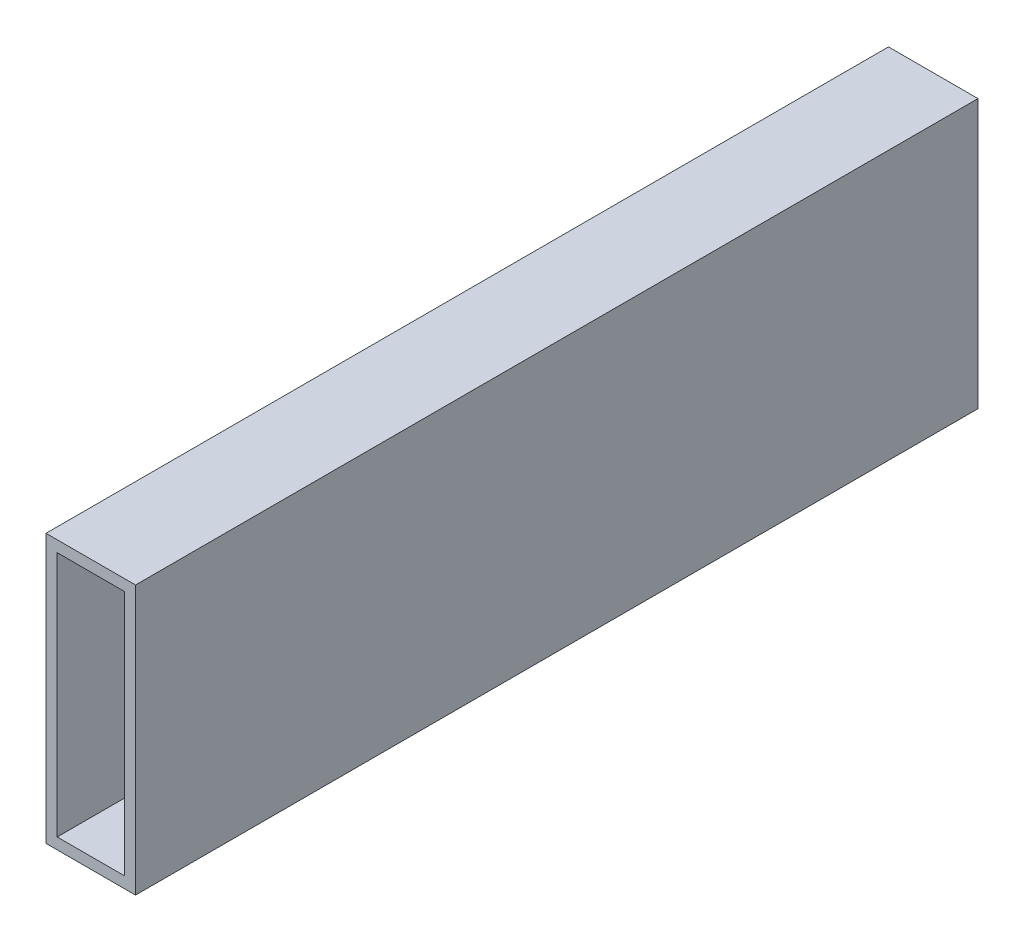
ISO-10303-21;
HEADER;
FILE_DESCRIPTION(('STEP AP214'),'2;1');
FILE_NAME('part.step','',(''),(''),'','','');
FILE_SCHEMA(('AUTOMOTIVE_DESIGN { 1 0 10303 214 1 1 1 1 }'));
ENDSEC;
DATA;
#1=APPLICATION_CONTEXT('core data for automotive mechanical design processes');
#2=APPLICATION_PROTOCOL_DEFINITION('international standard','automotive_design',2000,#1);
#3=PRODUCT_CONTEXT('',#1,'mechanical');
#4=PRODUCT('Part','Part','',(#3));
#5=PRODUCT_RELATED_PRODUCT_CATEGORY('part','',(#4));
#6=PRODUCT_DEFINITION_FORMATION('','',#4);
#7=PRODUCT_DEFINITION_CONTEXT('part definition',#1,'design');
#8=PRODUCT_DEFINITION('design','',#6,#7);
#9=PRODUCT_DEFINITION_SHAPE('','',#8);
#10=(LENGTH_UNIT() NAMED_UNIT(*) SI_UNIT(.MILLI.,.METRE.));
#11=(NAMED_UNIT(*) PLANE_ANGLE_UNIT() SI_UNIT($,.RADIAN.));
#12=(NAMED_UNIT(*) SI_UNIT($,.STERADIAN.) SOLID_ANGLE_UNIT());
#13=UNCERTAINTY_MEASURE_WITH_UNIT(LENGTH_MEASURE(1.E-05),#10,'distance_accuracy_value','');
#14=(GEOMETRIC_REPRESENTATION_CONTEXT(3) GLOBAL_UNCERTAINTY_ASSIGNED_CONTEXT((#13)) GLOBAL_UNIT_ASSIGNED_CONTEXT((#10,
#11,#12)) REPRESENTATION_CONTEXT('',''));
#15=CARTESIAN_POINT('',(0.,0.,0.));
#16=DIRECTION('',(0.,0.,1.));
#17=DIRECTION('',(1.,0.,0.));
#18=AXIS2_PLACEMENT_3D('',#15,#16,#17);
#19=CARTESIAN_POINT('',(0.,0.,239.014));
#20=DIRECTION('',(0.,0.,1.));
#21=DIRECTION('',(1.,0.,0.));
#22=AXIS2_PLACEMENT_3D('',#19,#20,#21);
#23=PLANE('',#22);
#24=DIRECTION('',(0.,1.,0.));
#25=VECTOR('',#24,1.);
#26=CARTESIAN_POINT('',(12.7,38.1,239.014));
#27=LINE('',#26,#25);
#28=CARTESIAN_POINT('',(12.7,-38.1,239.014));
#29=VERTEX_POINT('',#28);
#30=CARTESIAN_POINT('',(12.7,38.1,239.014));
#31=VERTEX_POINT('',#30);
#32=EDGE_CURVE('E153',#29,#31,#27,.T.);
#33=ORIENTED_EDGE('',*,*,#32,.T.);
#34=DIRECTION('',(-1.,0.,0.));
#35=VECTOR('',#34,1.);
#36=CARTESIAN_POINT('',(-12.7,38.1,239.014));
#37=LINE('',#36,#35);
#38=CARTESIAN_POINT('',(-12.7,38.1,239.014));
#39=VERTEX_POINT('',#38);
#40=EDGE_CURVE('E157',#31,#39,#37,.T.);
#41=ORIENTED_EDGE('',*,*,#40,.T.);
#42=DIRECTION('',(0.,-1.,0.));
#43=VECTOR('',#42,1.);
#44=CARTESIAN_POINT('',(-12.7,38.1,239.014));
#45=LINE('',#44,#43);
#46=CARTESIAN_POINT('',(-12.7,-38.1,239.014));
#47=VERTEX_POINT('',#46);
#48=EDGE_CURVE('E161',#39,#47,#45,.T.);
#49=ORIENTED_EDGE('',*,*,#48,.T.);
#50=DIRECTION('',(1.,0.,0.));
#51=VECTOR('',#50,1.);
#52=CARTESIAN_POINT('',(-12.7,-38.1,239.014));
#53=LINE('',#52,#51);
#54=EDGE_CURVE('E164',#47,#29,#53,.T.);
#55=ORIENTED_EDGE('',*,*,#54,.T.);
#56=EDGE_LOOP('',(#33,#41,#49,#55));
#57=FACE_BOUND('',#56,.T.);
#58=DIRECTION('',(1.,0.,0.));
#59=VECTOR('',#58,1.);
#60=CARTESIAN_POINT('',(-9.52499999999999,-34.925,239.014));
#61=LINE('',#60,#59);
#62=CARTESIAN_POINT('',(-9.52499999999999,-34.925,239.014));
#63=VERTEX_POINT('',#62);
#64=CARTESIAN_POINT('',(9.52500000000001,-34.925,239.014));
#65=VERTEX_POINT('',#64);
#66=EDGE_CURVE('E114',#63,#65,#61,.T.);
#67=ORIENTED_EDGE('',*,*,#66,.F.);
#68=DIRECTION('',(0.,-1.,0.));
#69=VECTOR('',#68,1.);
#70=CARTESIAN_POINT('',(-9.52499999999999,34.925,239.014));
#71=LINE('',#70,#69);
#72=CARTESIAN_POINT('',(-9.52499999999999,34.925,239.014));
#73=VERTEX_POINT('',#72);
#74=EDGE_CURVE('E105',#73,#63,#71,.T.);
#75=ORIENTED_EDGE('',*,*,#74,.F.);
#76=DIRECTION('',(-1.,0.,0.));
#77=VECTOR('',#76,1.);
#78=CARTESIAN_POINT('',(-9.52499999999999,34.925,239.014));
#79=LINE('',#78,#77);
#80=CARTESIAN_POINT('',(9.52499999999999,34.925,239.014));
#81=VERTEX_POINT('',#80);
#82=EDGE_CURVE('E131',#81,#73,#79,.T.);
#83=ORIENTED_EDGE('',*,*,#82,.F.);
#84=DIRECTION('',(0.,1.,0.));
#85=VECTOR('',#84,1.);
#86=CARTESIAN_POINT('',(9.52499999999999,34.925,239.014));
#87=LINE('',#86,#85);
#88=EDGE_CURVE('E127',#65,#81,#87,.T.);
#89=ORIENTED_EDGE('',*,*,#88,.F.);
#90=EDGE_LOOP('',(#67,#75,#83,#89));
#91=FACE_BOUND('',#90,.T.);
#92=ADVANCED_FACE('F39',(#57,#91),#23,.T.);
#93=CARTESIAN_POINT('',(0.,0.,0.));
#94=DIRECTION('',(0.,0.,1.));
#95=DIRECTION('',(1.,0.,0.));
#96=AXIS2_PLACEMENT_3D('',#93,#94,#95);
#97=PLANE('',#96);
#98=DIRECTION('',(0.,1.,0.));
#99=VECTOR('',#98,1.);
#100=CARTESIAN_POINT('',(12.7,38.1,0.));
#101=LINE('',#100,#99);
#102=CARTESIAN_POINT('',(12.7,-38.1,0.));
#103=VERTEX_POINT('',#102);
#104=CARTESIAN_POINT('',(12.7,38.1,0.));
#105=VERTEX_POINT('',#104);
#106=EDGE_CURVE('E123',#103,#105,#101,.T.);
#107=ORIENTED_EDGE('',*,*,#106,.F.);
#108=DIRECTION('',(1.,0.,0.));
#109=VECTOR('',#108,1.);
#110=CARTESIAN_POINT('',(-12.7,-38.1,0.));
#111=LINE('',#110,#109);
#112=CARTESIAN_POINT('',(-12.7,-38.1,0.));
#113=VERTEX_POINT('',#112);
#114=EDGE_CURVE('E158',#113,#103,#111,.T.);
#115=ORIENTED_EDGE('',*,*,#114,.F.);
#116=DIRECTION('',(0.,-1.,0.));
#117=VECTOR('',#116,1.);
#118=CARTESIAN_POINT('',(-12.7,38.1,0.));
#119=LINE('',#118,#117);
#120=CARTESIAN_POINT('',(-12.7,38.1,0.));
#121=VERTEX_POINT('',#120);
#122=EDGE_CURVE('E174',#121,#113,#119,.T.);
#123=ORIENTED_EDGE('',*,*,#122,.F.);
#124=DIRECTION('',(-1.,0.,0.));
#125=VECTOR('',#124,1.);
#126=CARTESIAN_POINT('',(-12.7,38.1,0.));
#127=LINE('',#126,#125);
#128=EDGE_CURVE('E171',#105,#121,#127,.T.);
#129=ORIENTED_EDGE('',*,*,#128,.F.);
#130=EDGE_LOOP('',(#107,#115,#123,#129));
#131=FACE_BOUND('',#130,.T.);
#132=DIRECTION('',(0.,-1.,0.));
#133=VECTOR('',#132,1.);
#134=CARTESIAN_POINT('',(-9.52499999999999,34.925,0.));
#135=LINE('',#134,#133);
#136=CARTESIAN_POINT('',(-9.52499999999999,34.925,0.));
#137=VERTEX_POINT('',#136);
#138=CARTESIAN_POINT('',(-9.52499999999999,-34.925,0.));
#139=VERTEX_POINT('',#138);
#140=EDGE_CURVE('E63',#137,#139,#135,.T.);
#141=ORIENTED_EDGE('',*,*,#140,.T.);
#142=DIRECTION('',(1.,0.,0.));
#143=VECTOR('',#142,1.);
#144=CARTESIAN_POINT('',(-9.52499999999999,-34.925,0.));
#145=LINE('',#144,#143);
#146=CARTESIAN_POINT('',(9.52500000000001,-34.925,0.));
#147=VERTEX_POINT('',#146);
#148=EDGE_CURVE('E121',#139,#147,#145,.T.);
#149=ORIENTED_EDGE('',*,*,#148,.T.);
#150=DIRECTION('',(0.,1.,0.));
#151=VECTOR('',#150,1.);
#152=CARTESIAN_POINT('',(9.52499999999999,34.925,0.));
#153=LINE('',#152,#151);
#154=CARTESIAN_POINT('',(9.52499999999999,34.925,0.));
#155=VERTEX_POINT('',#154);
#156=EDGE_CURVE('E140',#147,#155,#153,.T.);
#157=ORIENTED_EDGE('',*,*,#156,.T.);
#158=DIRECTION('',(-1.,0.,0.));
#159=VECTOR('',#158,1.);
#160=CARTESIAN_POINT('',(-9.52499999999999,34.925,0.));
#161=LINE('',#160,#159);
#162=EDGE_CURVE('E115',#155,#137,#161,.T.);
#163=ORIENTED_EDGE('',*,*,#162,.T.);
#164=EDGE_LOOP('',(#141,#149,#157,#163));
#165=FACE_BOUND('',#164,.T.);
#166=ADVANCED_FACE('F197',(#131,#165),#97,.F.);
#167=CARTESIAN_POINT('',(12.7,38.1,239.014));
#168=DIRECTION('',(-1.,0.,0.));
#169=DIRECTION('',(0.,-1.,0.));
#170=AXIS2_PLACEMENT_3D('',#167,#168,#169);
#171=PLANE('',#170);
#172=ORIENTED_EDGE('',*,*,#106,.T.);
#173=DIRECTION('',(0.,0.,-1.));
#174=VECTOR('',#173,1.);
#175=CARTESIAN_POINT('',(12.7,38.1,239.014));
#176=LINE('',#175,#174);
#177=EDGE_CURVE('E11',#31,#105,#176,.T.);
#178=ORIENTED_EDGE('',*,*,#177,.F.);
#179=ORIENTED_EDGE('',*,*,#32,.F.);
#180=DIRECTION('',(0.,0.,-1.));
#181=VECTOR('',#180,1.);
#182=CARTESIAN_POINT('',(12.7,-38.1,239.014));
#183=LINE('',#182,#181);
#184=EDGE_CURVE('E167',#29,#103,#183,.T.);
#185=ORIENTED_EDGE('',*,*,#184,.T.);
#186=EDGE_LOOP('',(#172,#178,#179,#185));
#187=FACE_BOUND('',#186,.T.);
#188=ADVANCED_FACE('F41',(#187),#171,.F.);
#189=CARTESIAN_POINT('',(-12.7,38.1,239.014));
#190=DIRECTION('',(0.,-1.,0.));
#191=DIRECTION('',(0.,0.,-1.));
#192=AXIS2_PLACEMENT_3D('',#189,#190,#191);
#193=PLANE('',#192);
#194=ORIENTED_EDGE('',*,*,#128,.T.);
#195=DIRECTION('',(0.,0.,-1.));
#196=VECTOR('',#195,1.);
#197=CARTESIAN_POINT('',(-12.7,38.1,239.014));
#198=LINE('',#197,#196);
#199=EDGE_CURVE('E48',#39,#121,#198,.T.);
#200=ORIENTED_EDGE('',*,*,#199,.F.);
#201=ORIENTED_EDGE('',*,*,#40,.F.);
#202=ORIENTED_EDGE('',*,*,#177,.T.);
#203=EDGE_LOOP('',(#194,#200,#201,#202));
#204=FACE_BOUND('',#203,.T.);
#205=ADVANCED_FACE('F207',(#204),#193,.F.);
#206=CARTESIAN_POINT('',(-12.7,38.1,239.014));
#207=DIRECTION('',(1.,0.,0.));
#208=DIRECTION('',(0.,1.,0.));
#209=AXIS2_PLACEMENT_3D('',#206,#207,#208);
#210=PLANE('',#209);
#211=ORIENTED_EDGE('',*,*,#122,.T.);
#212=DIRECTION('',(0.,0.,-1.));
#213=VECTOR('',#212,1.);
#214=CARTESIAN_POINT('',(-12.7,-38.1,239.014));
#215=LINE('',#214,#213);
#216=EDGE_CURVE('E182',#47,#113,#215,.T.);
#217=ORIENTED_EDGE('',*,*,#216,.F.);
#218=ORIENTED_EDGE('',*,*,#48,.F.);
#219=ORIENTED_EDGE('',*,*,#199,.T.);
#220=EDGE_LOOP('',(#211,#217,#218,#219));
#221=FACE_BOUND('',#220,.T.);
#222=ADVANCED_FACE('F191',(#221),#210,.F.);
#223=CARTESIAN_POINT('',(-12.7,-38.1,239.014));
#224=DIRECTION('',(0.,1.,0.));
#225=DIRECTION('',(0.,0.,1.));
#226=AXIS2_PLACEMENT_3D('',#223,#224,#225);
#227=PLANE('',#226);
#228=ORIENTED_EDGE('',*,*,#114,.T.);
#229=ORIENTED_EDGE('',*,*,#184,.F.);
#230=ORIENTED_EDGE('',*,*,#54,.F.);
#231=ORIENTED_EDGE('',*,*,#216,.T.);
#232=EDGE_LOOP('',(#228,#229,#230,#231));
#233=FACE_BOUND('',#232,.T.);
#234=ADVANCED_FACE('F201',(#233),#227,.F.);
#235=CARTESIAN_POINT('',(-9.52499999999999,34.925,239.014));
#236=DIRECTION('',(1.,0.,0.));
#237=DIRECTION('',(0.,1.,0.));
#238=AXIS2_PLACEMENT_3D('',#235,#236,#237);
#239=PLANE('',#238);
#240=ORIENTED_EDGE('',*,*,#140,.F.);
#241=DIRECTION('',(0.,0.,-1.));
#242=VECTOR('',#241,1.);
#243=CARTESIAN_POINT('',(-9.52499999999999,34.925,239.014));
#244=LINE('',#243,#242);
#245=EDGE_CURVE('E109',#73,#137,#244,.T.);
#246=ORIENTED_EDGE('',*,*,#245,.F.);
#247=ORIENTED_EDGE('',*,*,#74,.T.);
#248=DIRECTION('',(0.,0.,-1.));
#249=VECTOR('',#248,1.);
#250=CARTESIAN_POINT('',(-9.52499999999999,-34.925,239.014));
#251=LINE('',#250,#249);
#252=EDGE_CURVE('E108',#63,#139,#251,.T.);
#253=ORIENTED_EDGE('',*,*,#252,.T.);
#254=EDGE_LOOP('',(#240,#246,#247,#253));
#255=FACE_BOUND('',#254,.T.);
#256=ADVANCED_FACE('F107',(#255),#239,.T.);
#257=CARTESIAN_POINT('',(-9.52499999999999,-34.925,239.014));
#258=DIRECTION('',(0.,1.,0.));
#259=DIRECTION('',(-1.,0.,0.));
#260=AXIS2_PLACEMENT_3D('',#257,#258,#259);
#261=PLANE('',#260);
#262=ORIENTED_EDGE('',*,*,#148,.F.);
#263=ORIENTED_EDGE('',*,*,#252,.F.);
#264=ORIENTED_EDGE('',*,*,#66,.T.);
#265=DIRECTION('',(0.,0.,-1.));
#266=VECTOR('',#265,1.);
#267=CARTESIAN_POINT('',(9.52500000000001,-34.925,239.014));
#268=LINE('',#267,#266);
#269=EDGE_CURVE('E124',#65,#147,#268,.T.);
#270=ORIENTED_EDGE('',*,*,#269,.T.);
#271=EDGE_LOOP('',(#262,#263,#264,#270));
#272=FACE_BOUND('',#271,.T.);
#273=ADVANCED_FACE('F118',(#272),#261,.T.);
#274=CARTESIAN_POINT('',(9.52499999999999,34.925,239.014));
#275=DIRECTION('',(-1.,0.,0.));
#276=DIRECTION('',(0.,-1.,0.));
#277=AXIS2_PLACEMENT_3D('',#274,#275,#276);
#278=PLANE('',#277);
#279=ORIENTED_EDGE('',*,*,#156,.F.);
#280=ORIENTED_EDGE('',*,*,#269,.F.);
#281=ORIENTED_EDGE('',*,*,#88,.T.);
#282=DIRECTION('',(0.,0.,-1.));
#283=VECTOR('',#282,1.);
#284=CARTESIAN_POINT('',(9.52499999999999,34.925,239.014));
#285=LINE('',#284,#283);
#286=EDGE_CURVE('E55',#81,#155,#285,.T.);
#287=ORIENTED_EDGE('',*,*,#286,.T.);
#288=EDGE_LOOP('',(#279,#280,#281,#287));
#289=FACE_BOUND('',#288,.T.);
#290=ADVANCED_FACE('F230',(#289),#278,.T.);
#291=CARTESIAN_POINT('',(-9.52499999999999,34.925,239.014));
#292=DIRECTION('',(0.,-1.,0.));
#293=DIRECTION('',(1.,0.,0.));
#294=AXIS2_PLACEMENT_3D('',#291,#292,#293);
#295=PLANE('',#294);
#296=ORIENTED_EDGE('',*,*,#162,.F.);
#297=ORIENTED_EDGE('',*,*,#286,.F.);
#298=ORIENTED_EDGE('',*,*,#82,.T.);
#299=ORIENTED_EDGE('',*,*,#245,.T.);
#300=EDGE_LOOP('',(#296,#297,#298,#299));
#301=FACE_BOUND('',#300,.T.);
#302=ADVANCED_FACE('F234',(#301),#295,.T.);
#303=CLOSED_SHELL('',(#92,#166,#188,#205,#222,#234,#256,#273,#290,#302));
#304=MANIFOLD_SOLID_BREP('B2',#303);
#305=ADVANCED_BREP_SHAPE_REPRESENTATION('',(#18,#304),#14);
#306=SHAPE_DEFINITION_REPRESENTATION(#9,#305);
ENDSEC;
END-ISO-10303-21;
